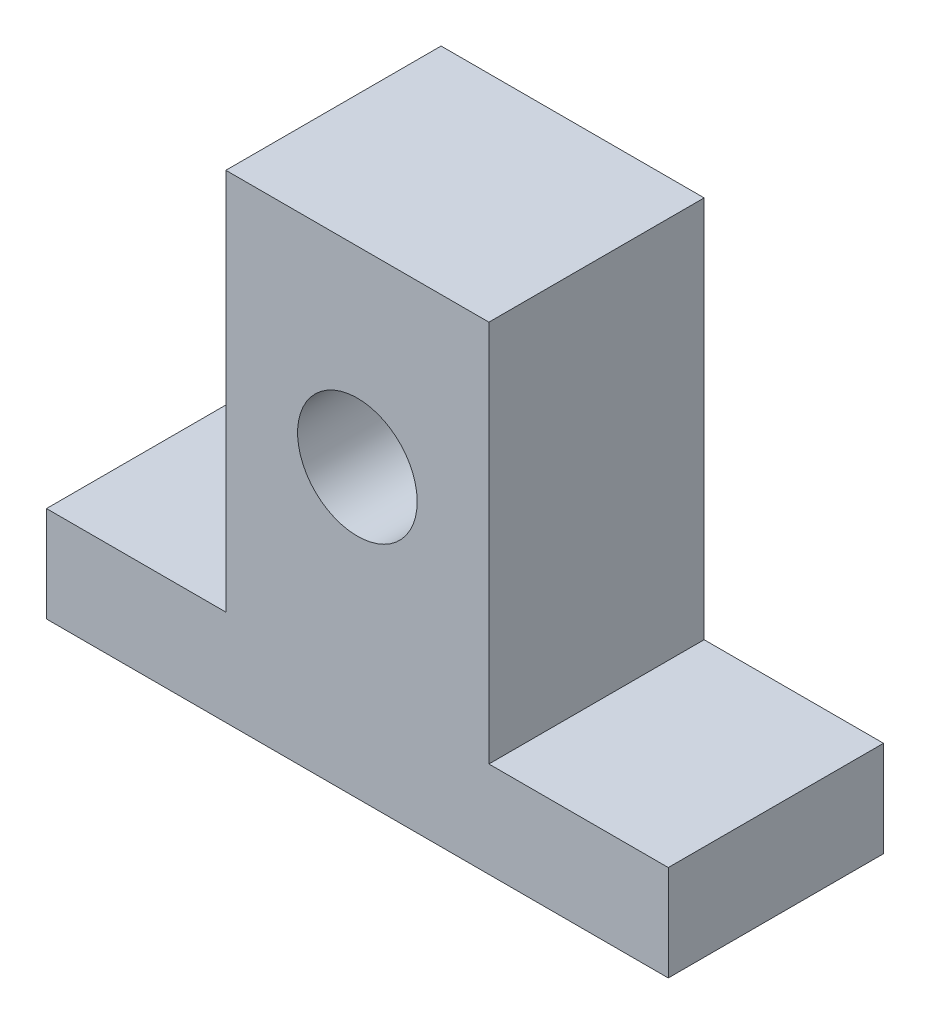
ISO-10303-21;
HEADER;
FILE_DESCRIPTION(('STEP AP214'),'2;1');
FILE_NAME('part.step','',(''),(''),'','','');
FILE_SCHEMA(('AUTOMOTIVE_DESIGN { 1 0 10303 214 1 1 1 1 }'));
ENDSEC;
DATA;
#1=APPLICATION_CONTEXT('core data for automotive mechanical design processes');
#2=APPLICATION_PROTOCOL_DEFINITION('international standard','automotive_design',2000,#1);
#3=PRODUCT_CONTEXT('',#1,'mechanical');
#4=PRODUCT('Part','Part','',(#3));
#5=PRODUCT_RELATED_PRODUCT_CATEGORY('part','',(#4));
#6=PRODUCT_DEFINITION_FORMATION('','',#4);
#7=PRODUCT_DEFINITION_CONTEXT('part definition',#1,'design');
#8=PRODUCT_DEFINITION('design','',#6,#7);
#9=PRODUCT_DEFINITION_SHAPE('','',#8);
#10=(LENGTH_UNIT() NAMED_UNIT(*) SI_UNIT(.MILLI.,.METRE.));
#11=(NAMED_UNIT(*) PLANE_ANGLE_UNIT() SI_UNIT($,.RADIAN.));
#12=(NAMED_UNIT(*) SI_UNIT($,.STERADIAN.) SOLID_ANGLE_UNIT());
#13=UNCERTAINTY_MEASURE_WITH_UNIT(LENGTH_MEASURE(1.E-05),#10,'distance_accuracy_value','');
#14=(GEOMETRIC_REPRESENTATION_CONTEXT(3) GLOBAL_UNCERTAINTY_ASSIGNED_CONTEXT((#13)) GLOBAL_UNIT_ASSIGNED_CONTEXT((#10,
#11,#12)) REPRESENTATION_CONTEXT('',''));
#15=CARTESIAN_POINT('',(0.,0.,0.));
#16=DIRECTION('',(0.,0.,1.));
#17=DIRECTION('',(1.,0.,0.));
#18=AXIS2_PLACEMENT_3D('',#15,#16,#17);
#19=CARTESIAN_POINT('',(-8.73125,0.,14.2875));
#20=DIRECTION('',(-1.,0.,0.));
#21=DIRECTION('',(0.,0.,1.));
#22=AXIS2_PLACEMENT_3D('',#19,#20,#21);
#23=PLANE('',#22);
#24=DIRECTION('',(0.,1.,0.));
#25=VECTOR('',#24,1.);
#26=CARTESIAN_POINT('',(-8.73125,0.,0.));
#27=LINE('',#26,#25);
#28=CARTESIAN_POINT('',(-8.73125,3.175,0.));
#29=VERTEX_POINT('',#28);
#30=CARTESIAN_POINT('',(-8.73125,28.575,0.));
#31=VERTEX_POINT('',#30);
#32=EDGE_CURVE('E165',#29,#31,#27,.T.);
#33=ORIENTED_EDGE('',*,*,#32,.F.);
#34=DIRECTION('',(0.,0.,-1.));
#35=VECTOR('',#34,1.);
#36=CARTESIAN_POINT('',(-8.73125,3.175,14.2875));
#37=LINE('',#36,#35);
#38=CARTESIAN_POINT('',(-8.73125,3.175,14.2875));
#39=VERTEX_POINT('',#38);
#40=EDGE_CURVE('E11',#39,#29,#37,.T.);
#41=ORIENTED_EDGE('',*,*,#40,.F.);
#42=DIRECTION('',(0.,1.,0.));
#43=VECTOR('',#42,1.);
#44=CARTESIAN_POINT('',(-8.73125,0.,14.2875));
#45=LINE('',#44,#43);
#46=CARTESIAN_POINT('',(-8.73125,28.575,14.2875));
#47=VERTEX_POINT('',#46);
#48=EDGE_CURVE('E131',#39,#47,#45,.T.);
#49=ORIENTED_EDGE('',*,*,#48,.T.);
#50=DIRECTION('',(0.,0.,-1.));
#51=VECTOR('',#50,1.);
#52=CARTESIAN_POINT('',(-8.73125,28.575,14.2875));
#53=LINE('',#52,#51);
#54=EDGE_CURVE('E51',#47,#31,#53,.T.);
#55=ORIENTED_EDGE('',*,*,#54,.T.);
#56=EDGE_LOOP('',(#33,#41,#49,#55));
#57=FACE_BOUND('',#56,.T.);
#58=ADVANCED_FACE('F34',(#57),#23,.T.);
#59=CARTESIAN_POINT('',(0.,3.175,14.2875));
#60=DIRECTION('',(0.,1.,0.));
#61=DIRECTION('',(0.,0.,1.));
#62=AXIS2_PLACEMENT_3D('',#59,#60,#61);
#63=PLANE('',#62);
#64=DIRECTION('',(1.,0.,0.));
#65=VECTOR('',#64,1.);
#66=CARTESIAN_POINT('',(0.,3.175,0.));
#67=LINE('',#66,#65);
#68=CARTESIAN_POINT('',(-20.6375,3.175,0.));
#69=VERTEX_POINT('',#68);
#70=EDGE_CURVE('E163',#69,#29,#67,.T.);
#71=ORIENTED_EDGE('',*,*,#70,.F.);
#72=DIRECTION('',(0.,0.,-1.));
#73=VECTOR('',#72,1.);
#74=CARTESIAN_POINT('',(-20.6375,3.175,14.2875));
#75=LINE('',#74,#73);
#76=CARTESIAN_POINT('',(-20.6375,3.175,14.2875));
#77=VERTEX_POINT('',#76);
#78=EDGE_CURVE('E43',#77,#69,#75,.T.);
#79=ORIENTED_EDGE('',*,*,#78,.F.);
#80=DIRECTION('',(1.,0.,0.));
#81=VECTOR('',#80,1.);
#82=CARTESIAN_POINT('',(0.,3.175,14.2875));
#83=LINE('',#82,#81);
#84=EDGE_CURVE('E124',#77,#39,#83,.T.);
#85=ORIENTED_EDGE('',*,*,#84,.T.);
#86=ORIENTED_EDGE('',*,*,#40,.T.);
#87=EDGE_LOOP('',(#71,#79,#85,#86));
#88=FACE_BOUND('',#87,.T.);
#89=ADVANCED_FACE('F164',(#88),#63,.T.);
#90=CARTESIAN_POINT('',(-20.6375,0.,14.2875));
#91=DIRECTION('',(-1.,0.,0.));
#92=DIRECTION('',(0.,0.,1.));
#93=AXIS2_PLACEMENT_3D('',#90,#91,#92);
#94=PLANE('',#93);
#95=DIRECTION('',(0.,1.,0.));
#96=VECTOR('',#95,1.);
#97=CARTESIAN_POINT('',(-20.6375,0.,0.));
#98=LINE('',#97,#96);
#99=CARTESIAN_POINT('',(-20.6375,-3.175,0.));
#100=VERTEX_POINT('',#99);
#101=EDGE_CURVE('E160',#100,#69,#98,.T.);
#102=ORIENTED_EDGE('',*,*,#101,.F.);
#103=DIRECTION('',(0.,0.,-1.));
#104=VECTOR('',#103,1.);
#105=CARTESIAN_POINT('',(-20.6375,-3.175,14.2875));
#106=LINE('',#105,#104);
#107=CARTESIAN_POINT('',(-20.6375,-3.175,14.2875));
#108=VERTEX_POINT('',#107);
#109=EDGE_CURVE('E154',#108,#100,#106,.T.);
#110=ORIENTED_EDGE('',*,*,#109,.F.);
#111=DIRECTION('',(0.,1.,0.));
#112=VECTOR('',#111,1.);
#113=CARTESIAN_POINT('',(-20.6375,0.,14.2875));
#114=LINE('',#113,#112);
#115=EDGE_CURVE('E130',#108,#77,#114,.T.);
#116=ORIENTED_EDGE('',*,*,#115,.T.);
#117=ORIENTED_EDGE('',*,*,#78,.T.);
#118=EDGE_LOOP('',(#102,#110,#116,#117));
#119=FACE_BOUND('',#118,.T.);
#120=ADVANCED_FACE('F158',(#119),#94,.T.);
#121=CARTESIAN_POINT('',(0.,-3.175,14.2875));
#122=DIRECTION('',(0.,1.,0.));
#123=DIRECTION('',(0.,0.,1.));
#124=AXIS2_PLACEMENT_3D('',#121,#122,#123);
#125=PLANE('',#124);
#126=DIRECTION('',(1.,0.,0.));
#127=VECTOR('',#126,1.);
#128=CARTESIAN_POINT('',(0.,-3.175,0.));
#129=LINE('',#128,#127);
#130=CARTESIAN_POINT('',(20.6375,-3.175,0.));
#131=VERTEX_POINT('',#130);
#132=EDGE_CURVE('E170',#100,#131,#129,.T.);
#133=ORIENTED_EDGE('',*,*,#132,.T.);
#134=DIRECTION('',(0.,0.,-1.));
#135=VECTOR('',#134,1.);
#136=CARTESIAN_POINT('',(20.6375,-3.175,14.2875));
#137=LINE('',#136,#135);
#138=CARTESIAN_POINT('',(20.6375,-3.175,14.2875));
#139=VERTEX_POINT('',#138);
#140=EDGE_CURVE('E151',#139,#131,#137,.T.);
#141=ORIENTED_EDGE('',*,*,#140,.F.);
#142=DIRECTION('',(1.,0.,0.));
#143=VECTOR('',#142,1.);
#144=CARTESIAN_POINT('',(0.,-3.175,14.2875));
#145=LINE('',#144,#143);
#146=EDGE_CURVE('E125',#108,#139,#145,.T.);
#147=ORIENTED_EDGE('',*,*,#146,.F.);
#148=ORIENTED_EDGE('',*,*,#109,.T.);
#149=EDGE_LOOP('',(#133,#141,#147,#148));
#150=FACE_BOUND('',#149,.T.);
#151=ADVANCED_FACE('F181',(#150),#125,.F.);
#152=CARTESIAN_POINT('',(20.6375,0.,14.2875));
#153=DIRECTION('',(-1.,0.,0.));
#154=DIRECTION('',(0.,0.,1.));
#155=AXIS2_PLACEMENT_3D('',#152,#153,#154);
#156=PLANE('',#155);
#157=DIRECTION('',(0.,1.,0.));
#158=VECTOR('',#157,1.);
#159=CARTESIAN_POINT('',(20.6375,0.,0.));
#160=LINE('',#159,#158);
#161=CARTESIAN_POINT('',(20.6375,3.175,0.));
#162=VERTEX_POINT('',#161);
#163=EDGE_CURVE('E172',#131,#162,#160,.T.);
#164=ORIENTED_EDGE('',*,*,#163,.T.);
#165=DIRECTION('',(0.,0.,-1.));
#166=VECTOR('',#165,1.);
#167=CARTESIAN_POINT('',(20.6375,3.175,14.2875));
#168=LINE('',#167,#166);
#169=CARTESIAN_POINT('',(20.6375,3.175,14.2875));
#170=VERTEX_POINT('',#169);
#171=EDGE_CURVE('E111',#170,#162,#168,.T.);
#172=ORIENTED_EDGE('',*,*,#171,.F.);
#173=DIRECTION('',(0.,1.,0.));
#174=VECTOR('',#173,1.);
#175=CARTESIAN_POINT('',(20.6375,0.,14.2875));
#176=LINE('',#175,#174);
#177=EDGE_CURVE('E121',#139,#170,#176,.T.);
#178=ORIENTED_EDGE('',*,*,#177,.F.);
#179=ORIENTED_EDGE('',*,*,#140,.T.);
#180=EDGE_LOOP('',(#164,#172,#178,#179));
#181=FACE_BOUND('',#180,.T.);
#182=ADVANCED_FACE('F178',(#181),#156,.F.);
#183=CARTESIAN_POINT('',(8.73125,3.175,0.));
#184=VERTEX_POINT('',#183);
#185=EDGE_CURVE('E108',#184,#162,#67,.T.);
#186=ORIENTED_EDGE('',*,*,#185,.F.);
#187=DIRECTION('',(0.,0.,-1.));
#188=VECTOR('',#187,1.);
#189=CARTESIAN_POINT('',(8.73125,3.175,14.2875));
#190=LINE('',#189,#188);
#191=CARTESIAN_POINT('',(8.73125,3.175,14.2875));
#192=VERTEX_POINT('',#191);
#193=EDGE_CURVE('E102',#192,#184,#190,.T.);
#194=ORIENTED_EDGE('',*,*,#193,.F.);
#195=EDGE_CURVE('E106',#192,#170,#83,.T.);
#196=ORIENTED_EDGE('',*,*,#195,.T.);
#197=ORIENTED_EDGE('',*,*,#171,.T.);
#198=EDGE_LOOP('',(#186,#194,#196,#197));
#199=FACE_BOUND('',#198,.T.);
#200=ADVANCED_FACE('F104',(#199),#63,.T.);
#201=CARTESIAN_POINT('',(8.73125,0.,14.2875));
#202=DIRECTION('',(-1.,0.,0.));
#203=DIRECTION('',(0.,0.,1.));
#204=AXIS2_PLACEMENT_3D('',#201,#202,#203);
#205=PLANE('',#204);
#206=DIRECTION('',(0.,1.,0.));
#207=VECTOR('',#206,1.);
#208=CARTESIAN_POINT('',(8.73125,0.,0.));
#209=LINE('',#208,#207);
#210=CARTESIAN_POINT('',(8.73125,28.575,0.));
#211=VERTEX_POINT('',#210);
#212=EDGE_CURVE('E142',#184,#211,#209,.T.);
#213=ORIENTED_EDGE('',*,*,#212,.T.);
#214=DIRECTION('',(0.,0.,-1.));
#215=VECTOR('',#214,1.);
#216=CARTESIAN_POINT('',(8.73125,28.575,14.2875));
#217=LINE('',#216,#215);
#218=CARTESIAN_POINT('',(8.73125,28.575,14.2875));
#219=VERTEX_POINT('',#218);
#220=EDGE_CURVE('E77',#219,#211,#217,.T.);
#221=ORIENTED_EDGE('',*,*,#220,.F.);
#222=DIRECTION('',(0.,1.,0.));
#223=VECTOR('',#222,1.);
#224=CARTESIAN_POINT('',(8.73125,0.,14.2875));
#225=LINE('',#224,#223);
#226=EDGE_CURVE('E113',#192,#219,#225,.T.);
#227=ORIENTED_EDGE('',*,*,#226,.F.);
#228=ORIENTED_EDGE('',*,*,#193,.T.);
#229=EDGE_LOOP('',(#213,#221,#227,#228));
#230=FACE_BOUND('',#229,.T.);
#231=ADVANCED_FACE('F114',(#230),#205,.F.);
#232=CARTESIAN_POINT('',(0.,15.875,14.2875));
#233=DIRECTION('',(0.,0.,-1.));
#234=DIRECTION('',(-1.,0.,0.));
#235=AXIS2_PLACEMENT_3D('',#232,#233,#234);
#236=CYLINDRICAL_SURFACE('',#235,3.96875);
#237=CARTESIAN_POINT('',(0.,15.875,14.2875));
#238=DIRECTION('',(0.,0.,1.));
#239=DIRECTION('',(1.,0.,0.));
#240=AXIS2_PLACEMENT_3D('',#237,#238,#239);
#241=CIRCLE('',#240,3.96875);
#242=CARTESIAN_POINT('',(3.96875,15.875,14.2875));
#243=VERTEX_POINT('',#242);
#244=EDGE_CURVE('E135',#243,#243,#241,.T.);
#245=ORIENTED_EDGE('',*,*,#244,.T.);
#246=EDGE_LOOP('',(#245));
#247=FACE_BOUND('',#246,.T.);
#248=CARTESIAN_POINT('',(0.,15.875,0.));
#249=DIRECTION('',(0.,0.,1.));
#250=DIRECTION('',(1.,0.,0.));
#251=AXIS2_PLACEMENT_3D('',#248,#249,#250);
#252=CIRCLE('',#251,3.96875);
#253=CARTESIAN_POINT('',(3.96875,15.875,0.));
#254=VERTEX_POINT('',#253);
#255=EDGE_CURVE('E185',#254,#254,#252,.T.);
#256=ORIENTED_EDGE('',*,*,#255,.F.);
#257=EDGE_LOOP('',(#256));
#258=FACE_BOUND('',#257,.T.);
#259=ADVANCED_FACE('F36',(#247,#258),#236,.F.);
#260=CARTESIAN_POINT('',(0.,28.575,14.2875));
#261=DIRECTION('',(0.,1.,0.));
#262=DIRECTION('',(-1.,0.,0.));
#263=AXIS2_PLACEMENT_3D('',#260,#261,#262);
#264=PLANE('',#263);
#265=DIRECTION('',(1.,0.,0.));
#266=VECTOR('',#265,1.);
#267=CARTESIAN_POINT('',(0.,28.575,0.));
#268=LINE('',#267,#266);
#269=EDGE_CURVE('E137',#31,#211,#268,.T.);
#270=ORIENTED_EDGE('',*,*,#269,.F.);
#271=ORIENTED_EDGE('',*,*,#54,.F.);
#272=DIRECTION('',(1.,0.,0.));
#273=VECTOR('',#272,1.);
#274=CARTESIAN_POINT('',(0.,28.575,14.2875));
#275=LINE('',#274,#273);
#276=EDGE_CURVE('E117',#47,#219,#275,.T.);
#277=ORIENTED_EDGE('',*,*,#276,.T.);
#278=ORIENTED_EDGE('',*,*,#220,.T.);
#279=EDGE_LOOP('',(#270,#271,#277,#278));
#280=FACE_BOUND('',#279,.T.);
#281=ADVANCED_FACE('F187',(#280),#264,.T.);
#282=CARTESIAN_POINT('',(0.,0.,14.2875));
#283=DIRECTION('',(0.,0.,1.));
#284=DIRECTION('',(1.,0.,0.));
#285=AXIS2_PLACEMENT_3D('',#282,#283,#284);
#286=PLANE('',#285);
#287=ORIENTED_EDGE('',*,*,#244,.F.);
#288=EDGE_LOOP('',(#287));
#289=FACE_BOUND('',#288,.T.);
#290=ORIENTED_EDGE('',*,*,#48,.F.);
#291=ORIENTED_EDGE('',*,*,#84,.F.);
#292=ORIENTED_EDGE('',*,*,#115,.F.);
#293=ORIENTED_EDGE('',*,*,#146,.T.);
#294=ORIENTED_EDGE('',*,*,#177,.T.);
#295=ORIENTED_EDGE('',*,*,#195,.F.);
#296=ORIENTED_EDGE('',*,*,#226,.T.);
#297=ORIENTED_EDGE('',*,*,#276,.F.);
#298=EDGE_LOOP('',(#290,#291,#292,#293,#294,#295,#296,#297));
#299=FACE_BOUND('',#298,.T.);
#300=ADVANCED_FACE('F119',(#289,#299),#286,.T.);
#301=CARTESIAN_POINT('',(0.,0.,0.));
#302=DIRECTION('',(0.,0.,1.));
#303=DIRECTION('',(1.,0.,0.));
#304=AXIS2_PLACEMENT_3D('',#301,#302,#303);
#305=PLANE('',#304);
#306=ORIENTED_EDGE('',*,*,#255,.T.);
#307=EDGE_LOOP('',(#306));
#308=FACE_BOUND('',#307,.T.);
#309=ORIENTED_EDGE('',*,*,#32,.T.);
#310=ORIENTED_EDGE('',*,*,#269,.T.);
#311=ORIENTED_EDGE('',*,*,#212,.F.);
#312=ORIENTED_EDGE('',*,*,#185,.T.);
#313=ORIENTED_EDGE('',*,*,#163,.F.);
#314=ORIENTED_EDGE('',*,*,#132,.F.);
#315=ORIENTED_EDGE('',*,*,#101,.T.);
#316=ORIENTED_EDGE('',*,*,#70,.T.);
#317=EDGE_LOOP('',(#309,#310,#311,#312,#313,#314,#315,#316));
#318=FACE_BOUND('',#317,.T.);
#319=ADVANCED_FACE('F168',(#308,#318),#305,.F.);
#320=CLOSED_SHELL('',(#58,#89,#120,#151,#182,#200,#231,#259,#281,#300,#319));
#321=MANIFOLD_SOLID_BREP('B2',#320);
#322=ADVANCED_BREP_SHAPE_REPRESENTATION('',(#18,#321),#14);
#323=SHAPE_DEFINITION_REPRESENTATION(#9,#322);
ENDSEC;
END-ISO-10303-21;
